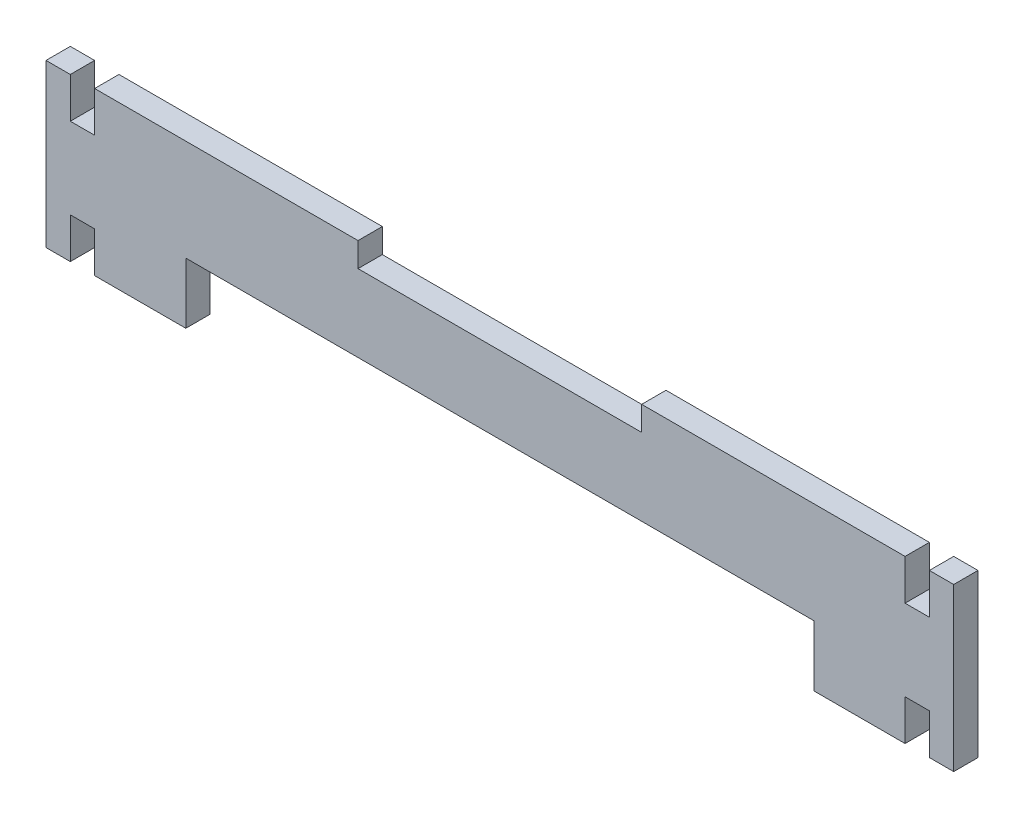
ISO-10303-21;
HEADER;
FILE_DESCRIPTION(('STEP AP214'),'2;1');
FILE_NAME('part.step','',(''),(''),'','','');
FILE_SCHEMA(('AUTOMOTIVE_DESIGN { 1 0 10303 214 1 1 1 1 }'));
ENDSEC;
DATA;
#1=APPLICATION_CONTEXT('core data for automotive mechanical design processes');
#2=APPLICATION_PROTOCOL_DEFINITION('international standard','automotive_design',2000,#1);
#3=PRODUCT_CONTEXT('',#1,'mechanical');
#4=PRODUCT('Part','Part','',(#3));
#5=PRODUCT_RELATED_PRODUCT_CATEGORY('part','',(#4));
#6=PRODUCT_DEFINITION_FORMATION('','',#4);
#7=PRODUCT_DEFINITION_CONTEXT('part definition',#1,'design');
#8=PRODUCT_DEFINITION('design','',#6,#7);
#9=PRODUCT_DEFINITION_SHAPE('','',#8);
#10=(LENGTH_UNIT() NAMED_UNIT(*) SI_UNIT(.MILLI.,.METRE.));
#11=(NAMED_UNIT(*) PLANE_ANGLE_UNIT() SI_UNIT($,.RADIAN.));
#12=(NAMED_UNIT(*) SI_UNIT($,.STERADIAN.) SOLID_ANGLE_UNIT());
#13=UNCERTAINTY_MEASURE_WITH_UNIT(LENGTH_MEASURE(1.E-05),#10,'distance_accuracy_value','');
#14=(GEOMETRIC_REPRESENTATION_CONTEXT(3) GLOBAL_UNCERTAINTY_ASSIGNED_CONTEXT((#13)) GLOBAL_UNIT_ASSIGNED_CONTEXT((#10,
#11,#12)) REPRESENTATION_CONTEXT('',''));
#15=CARTESIAN_POINT('',(0.,0.,0.));
#16=DIRECTION('',(0.,0.,1.));
#17=DIRECTION('',(1.,0.,0.));
#18=AXIS2_PLACEMENT_3D('',#15,#16,#17);
#19=CARTESIAN_POINT('',(0.,0.,6.));
#20=DIRECTION('',(0.,1.,0.));
#21=DIRECTION('',(-1.,0.,0.));
#22=AXIS2_PLACEMENT_3D('',#19,#20,#21);
#23=PLANE('',#22);
#24=DIRECTION('',(1.,0.,0.));
#25=VECTOR('',#24,1.);
#26=CARTESIAN_POINT('',(0.,0.,0.));
#27=LINE('',#26,#25);
#28=CARTESIAN_POINT('',(-212.,0.,0.));
#29=VERTEX_POINT('',#28);
#30=CARTESIAN_POINT('',(-189.5,0.,0.));
#31=VERTEX_POINT('',#30);
#32=EDGE_CURVE('E246',#29,#31,#27,.T.);
#33=ORIENTED_EDGE('',*,*,#32,.T.);
#34=DIRECTION('',(0.,0.,1.));
#35=VECTOR('',#34,1.);
#36=CARTESIAN_POINT('',(-189.5,0.,-4.));
#37=LINE('',#36,#35);
#38=CARTESIAN_POINT('',(-189.5,0.,6.));
#39=VERTEX_POINT('',#38);
#40=EDGE_CURVE('E231',#31,#39,#37,.T.);
#41=ORIENTED_EDGE('',*,*,#40,.T.);
#42=DIRECTION('',(1.,0.,0.));
#43=VECTOR('',#42,1.);
#44=CARTESIAN_POINT('',(0.,0.,6.));
#45=LINE('',#44,#43);
#46=CARTESIAN_POINT('',(-212.,0.,6.));
#47=VERTEX_POINT('',#46);
#48=EDGE_CURVE('E244',#47,#39,#45,.T.);
#49=ORIENTED_EDGE('',*,*,#48,.F.);
#50=DIRECTION('',(0.,0.,1.));
#51=VECTOR('',#50,1.);
#52=CARTESIAN_POINT('',(-212.,0.,0.));
#53=LINE('',#52,#51);
#54=EDGE_CURVE('E367',#29,#47,#53,.T.);
#55=ORIENTED_EDGE('',*,*,#54,.F.);
#56=EDGE_LOOP('',(#33,#41,#49,#55));
#57=FACE_BOUND('',#56,.T.);
#58=ADVANCED_FACE('F44',(#57),#23,.F.);
#59=CARTESIAN_POINT('',(0.,40.,6.));
#60=DIRECTION('',(0.,-1.,0.));
#61=DIRECTION('',(1.,0.,0.));
#62=AXIS2_PLACEMENT_3D('',#59,#60,#61);
#63=PLANE('',#62);
#64=DIRECTION('',(-1.,0.,0.));
#65=VECTOR('',#64,1.);
#66=CARTESIAN_POINT('',(0.,40.,6.));
#67=LINE('',#66,#65);
#68=CARTESIAN_POINT('',(-147.,40.,6.));
#69=VERTEX_POINT('',#68);
#70=CARTESIAN_POINT('',(-212.,40.,6.));
#71=VERTEX_POINT('',#70);
#72=EDGE_CURVE('E274',#69,#71,#67,.T.);
#73=ORIENTED_EDGE('',*,*,#72,.F.);
#74=DIRECTION('',(0.,0.,1.));
#75=VECTOR('',#74,1.);
#76=CARTESIAN_POINT('',(-147.,40.,0.));
#77=LINE('',#76,#75);
#78=CARTESIAN_POINT('',(-147.,40.,0.));
#79=VERTEX_POINT('',#78);
#80=EDGE_CURVE('E330',#79,#69,#77,.T.);
#81=ORIENTED_EDGE('',*,*,#80,.F.);
#82=DIRECTION('',(-1.,0.,0.));
#83=VECTOR('',#82,1.);
#84=CARTESIAN_POINT('',(0.,40.,0.));
#85=LINE('',#84,#83);
#86=CARTESIAN_POINT('',(-212.,40.,0.));
#87=VERTEX_POINT('',#86);
#88=EDGE_CURVE('E447',#79,#87,#85,.T.);
#89=ORIENTED_EDGE('',*,*,#88,.T.);
#90=DIRECTION('',(0.,0.,1.));
#91=VECTOR('',#90,1.);
#92=CARTESIAN_POINT('',(-212.,40.,0.));
#93=LINE('',#92,#91);
#94=EDGE_CURVE('E285',#87,#71,#93,.T.);
#95=ORIENTED_EDGE('',*,*,#94,.T.);
#96=EDGE_LOOP('',(#73,#81,#89,#95));
#97=FACE_BOUND('',#96,.T.);
#98=ADVANCED_FACE('F524',(#97),#63,.F.);
#99=CARTESIAN_POINT('',(-12.,40.,0.));
#100=VERTEX_POINT('',#99);
#101=CARTESIAN_POINT('',(-77.,40.,0.));
#102=VERTEX_POINT('',#101);
#103=EDGE_CURVE('E446',#100,#102,#85,.T.);
#104=ORIENTED_EDGE('',*,*,#103,.T.);
#105=DIRECTION('',(0.,0.,1.));
#106=VECTOR('',#105,1.);
#107=CARTESIAN_POINT('',(-77.,40.,0.));
#108=LINE('',#107,#106);
#109=CARTESIAN_POINT('',(-77.,40.,6.));
#110=VERTEX_POINT('',#109);
#111=EDGE_CURVE('E390',#102,#110,#108,.T.);
#112=ORIENTED_EDGE('',*,*,#111,.T.);
#113=CARTESIAN_POINT('',(-12.,40.,6.));
#114=VERTEX_POINT('',#113);
#115=EDGE_CURVE('E272',#114,#110,#67,.T.);
#116=ORIENTED_EDGE('',*,*,#115,.F.);
#117=DIRECTION('',(0.,0.,1.));
#118=VECTOR('',#117,1.);
#119=CARTESIAN_POINT('',(-12.,40.,0.));
#120=LINE('',#119,#118);
#121=EDGE_CURVE('E346',#100,#114,#120,.T.);
#122=ORIENTED_EDGE('',*,*,#121,.F.);
#123=EDGE_LOOP('',(#104,#112,#116,#122));
#124=FACE_BOUND('',#123,.T.);
#125=ADVANCED_FACE('F461',(#124),#63,.F.);
#126=CARTESIAN_POINT('',(-224.,0.,0.));
#127=VERTEX_POINT('',#126);
#128=CARTESIAN_POINT('',(-218.,0.,0.));
#129=VERTEX_POINT('',#128);
#130=EDGE_CURVE('E279',#127,#129,#27,.T.);
#131=ORIENTED_EDGE('',*,*,#130,.T.);
#132=DIRECTION('',(0.,0.,1.));
#133=VECTOR('',#132,1.);
#134=CARTESIAN_POINT('',(-218.,0.,0.));
#135=LINE('',#134,#133);
#136=CARTESIAN_POINT('',(-218.,0.,6.));
#137=VERTEX_POINT('',#136);
#138=EDGE_CURVE('E364',#129,#137,#135,.T.);
#139=ORIENTED_EDGE('',*,*,#138,.T.);
#140=CARTESIAN_POINT('',(-224.,0.,6.));
#141=VERTEX_POINT('',#140);
#142=EDGE_CURVE('E255',#141,#137,#45,.T.);
#143=ORIENTED_EDGE('',*,*,#142,.F.);
#144=DIRECTION('',(0.,0.,-1.));
#145=VECTOR('',#144,1.);
#146=CARTESIAN_POINT('',(-224.,0.,6.));
#147=LINE('',#146,#145);
#148=EDGE_CURVE('E434',#141,#127,#147,.T.);
#149=ORIENTED_EDGE('',*,*,#148,.T.);
#150=EDGE_LOOP('',(#131,#139,#143,#149));
#151=FACE_BOUND('',#150,.T.);
#152=ADVANCED_FACE('F484',(#151),#23,.F.);
#153=CARTESIAN_POINT('',(-34.5,0.,6.));
#154=VERTEX_POINT('',#153);
#155=CARTESIAN_POINT('',(-12.,0.,6.));
#156=VERTEX_POINT('',#155);
#157=EDGE_CURVE('E256',#154,#156,#45,.T.);
#158=ORIENTED_EDGE('',*,*,#157,.F.);
#159=DIRECTION('',(0.,0.,1.));
#160=VECTOR('',#159,1.);
#161=CARTESIAN_POINT('',(-34.5,0.,-4.));
#162=LINE('',#161,#160);
#163=CARTESIAN_POINT('',(-34.5,0.,0.));
#164=VERTEX_POINT('',#163);
#165=EDGE_CURVE('E247',#164,#154,#162,.T.);
#166=ORIENTED_EDGE('',*,*,#165,.F.);
#167=CARTESIAN_POINT('',(-12.,0.,0.));
#168=VERTEX_POINT('',#167);
#169=EDGE_CURVE('E425',#164,#168,#27,.T.);
#170=ORIENTED_EDGE('',*,*,#169,.T.);
#171=DIRECTION('',(0.,0.,1.));
#172=VECTOR('',#171,1.);
#173=CARTESIAN_POINT('',(-12.,0.,0.));
#174=LINE('',#173,#172);
#175=EDGE_CURVE('E309',#168,#156,#174,.T.);
#176=ORIENTED_EDGE('',*,*,#175,.T.);
#177=EDGE_LOOP('',(#158,#166,#170,#176));
#178=FACE_BOUND('',#177,.T.);
#179=ADVANCED_FACE('F533',(#178),#23,.F.);
#180=CARTESIAN_POINT('',(-218.,40.,6.));
#181=VERTEX_POINT('',#180);
#182=CARTESIAN_POINT('',(-224.,40.,6.));
#183=VERTEX_POINT('',#182);
#184=EDGE_CURVE('E275',#181,#183,#67,.T.);
#185=ORIENTED_EDGE('',*,*,#184,.F.);
#186=DIRECTION('',(0.,0.,1.));
#187=VECTOR('',#186,1.);
#188=CARTESIAN_POINT('',(-218.,40.,0.));
#189=LINE('',#188,#187);
#190=CARTESIAN_POINT('',(-218.,40.,0.));
#191=VERTEX_POINT('',#190);
#192=EDGE_CURVE('E288',#191,#181,#189,.T.);
#193=ORIENTED_EDGE('',*,*,#192,.F.);
#194=CARTESIAN_POINT('',(-224.,40.,0.));
#195=VERTEX_POINT('',#194);
#196=EDGE_CURVE('E448',#191,#195,#85,.T.);
#197=ORIENTED_EDGE('',*,*,#196,.T.);
#198=DIRECTION('',(0.,0.,-1.));
#199=VECTOR('',#198,1.);
#200=CARTESIAN_POINT('',(-224.,40.,6.));
#201=LINE('',#200,#199);
#202=EDGE_CURVE('E429',#183,#195,#201,.T.);
#203=ORIENTED_EDGE('',*,*,#202,.F.);
#204=EDGE_LOOP('',(#185,#193,#197,#203));
#205=FACE_BOUND('',#204,.T.);
#206=ADVANCED_FACE('F477',(#205),#63,.F.);
#207=CARTESIAN_POINT('',(0.,0.,6.));
#208=DIRECTION('',(-1.,0.,0.));
#209=DIRECTION('',(0.,0.,1.));
#210=AXIS2_PLACEMENT_3D('',#207,#208,#209);
#211=PLANE('',#210);
#212=DIRECTION('',(0.,1.,0.));
#213=VECTOR('',#212,1.);
#214=CARTESIAN_POINT('',(0.,0.,0.));
#215=LINE('',#214,#213);
#216=CARTESIAN_POINT('',(0.,0.,0.));
#217=VERTEX_POINT('',#216);
#218=CARTESIAN_POINT('',(0.,40.,0.));
#219=VERTEX_POINT('',#218);
#220=EDGE_CURVE('E290',#217,#219,#215,.T.);
#221=ORIENTED_EDGE('',*,*,#220,.T.);
#222=DIRECTION('',(0.,0.,-1.));
#223=VECTOR('',#222,1.);
#224=CARTESIAN_POINT('',(0.,40.,6.));
#225=LINE('',#224,#223);
#226=CARTESIAN_POINT('',(0.,40.,6.));
#227=VERTEX_POINT('',#226);
#228=EDGE_CURVE('E426',#227,#219,#225,.T.);
#229=ORIENTED_EDGE('',*,*,#228,.F.);
#230=DIRECTION('',(0.,1.,0.));
#231=VECTOR('',#230,1.);
#232=CARTESIAN_POINT('',(0.,0.,6.));
#233=LINE('',#232,#231);
#234=CARTESIAN_POINT('',(0.,0.,6.));
#235=VERTEX_POINT('',#234);
#236=EDGE_CURVE('E277',#235,#227,#233,.T.);
#237=ORIENTED_EDGE('',*,*,#236,.F.);
#238=DIRECTION('',(0.,0.,-1.));
#239=VECTOR('',#238,1.);
#240=CARTESIAN_POINT('',(0.,0.,6.));
#241=LINE('',#240,#239);
#242=EDGE_CURVE('E260',#235,#217,#241,.T.);
#243=ORIENTED_EDGE('',*,*,#242,.T.);
#244=EDGE_LOOP('',(#221,#229,#237,#243));
#245=FACE_BOUND('',#244,.T.);
#246=ADVANCED_FACE('F46',(#245),#211,.F.);
#247=CARTESIAN_POINT('',(-6.00000000000001,40.,0.));
#248=VERTEX_POINT('',#247);
#249=EDGE_CURVE('E444',#219,#248,#85,.T.);
#250=ORIENTED_EDGE('',*,*,#249,.T.);
#251=DIRECTION('',(0.,0.,1.));
#252=VECTOR('',#251,1.);
#253=CARTESIAN_POINT('',(-6.00000000000001,40.,0.));
#254=LINE('',#253,#252);
#255=CARTESIAN_POINT('',(-6.00000000000001,40.,6.));
#256=VERTEX_POINT('',#255);
#257=EDGE_CURVE('E343',#248,#256,#254,.T.);
#258=ORIENTED_EDGE('',*,*,#257,.T.);
#259=EDGE_CURVE('E268',#227,#256,#67,.T.);
#260=ORIENTED_EDGE('',*,*,#259,.F.);
#261=ORIENTED_EDGE('',*,*,#228,.T.);
#262=EDGE_LOOP('',(#250,#258,#260,#261));
#263=FACE_BOUND('',#262,.T.);
#264=ADVANCED_FACE('F500',(#263),#63,.F.);
#265=CARTESIAN_POINT('',(-224.,0.,6.));
#266=DIRECTION('',(1.,0.,0.));
#267=DIRECTION('',(0.,0.,-1.));
#268=AXIS2_PLACEMENT_3D('',#265,#266,#267);
#269=PLANE('',#268);
#270=DIRECTION('',(0.,-1.,0.));
#271=VECTOR('',#270,1.);
#272=CARTESIAN_POINT('',(-224.,0.,0.));
#273=LINE('',#272,#271);
#274=EDGE_CURVE('E441',#195,#127,#273,.T.);
#275=ORIENTED_EDGE('',*,*,#274,.T.);
#276=ORIENTED_EDGE('',*,*,#148,.F.);
#277=DIRECTION('',(0.,-1.,0.));
#278=VECTOR('',#277,1.);
#279=CARTESIAN_POINT('',(-224.,0.,6.));
#280=LINE('',#279,#278);
#281=EDGE_CURVE('E263',#183,#141,#280,.T.);
#282=ORIENTED_EDGE('',*,*,#281,.F.);
#283=ORIENTED_EDGE('',*,*,#202,.T.);
#284=EDGE_LOOP('',(#275,#276,#282,#283));
#285=FACE_BOUND('',#284,.T.);
#286=ADVANCED_FACE('F480',(#285),#269,.F.);
#287=CARTESIAN_POINT('',(-6.00000000000001,0.,6.));
#288=VERTEX_POINT('',#287);
#289=EDGE_CURVE('E258',#288,#235,#45,.T.);
#290=ORIENTED_EDGE('',*,*,#289,.F.);
#291=DIRECTION('',(0.,0.,1.));
#292=VECTOR('',#291,1.);
#293=CARTESIAN_POINT('',(-6.00000000000001,0.,0.));
#294=LINE('',#293,#292);
#295=CARTESIAN_POINT('',(-6.00000000000001,0.,0.));
#296=VERTEX_POINT('',#295);
#297=EDGE_CURVE('E312',#296,#288,#294,.T.);
#298=ORIENTED_EDGE('',*,*,#297,.F.);
#299=EDGE_CURVE('E443',#296,#217,#27,.T.);
#300=ORIENTED_EDGE('',*,*,#299,.T.);
#301=ORIENTED_EDGE('',*,*,#242,.F.);
#302=EDGE_LOOP('',(#290,#298,#300,#301));
#303=FACE_BOUND('',#302,.T.);
#304=ADVANCED_FACE('F497',(#303),#23,.F.);
#305=CARTESIAN_POINT('',(0.,0.,6.));
#306=DIRECTION('',(0.,0.,1.));
#307=DIRECTION('',(1.,0.,0.));
#308=AXIS2_PLACEMENT_3D('',#305,#306,#307);
#309=PLANE('',#308);
#310=DIRECTION('',(0.,-1.,0.));
#311=VECTOR('',#310,1.);
#312=CARTESIAN_POINT('',(-189.5,0.,6.));
#313=LINE('',#312,#311);
#314=CARTESIAN_POINT('',(-189.5,15.,6.));
#315=VERTEX_POINT('',#314);
#316=EDGE_CURVE('E228',#315,#39,#313,.T.);
#317=ORIENTED_EDGE('',*,*,#316,.F.);
#318=DIRECTION('',(-1.,0.,0.));
#319=VECTOR('',#318,1.);
#320=CARTESIAN_POINT('',(-189.5,15.,6.));
#321=LINE('',#320,#319);
#322=CARTESIAN_POINT('',(-34.5,15.,6.));
#323=VERTEX_POINT('',#322);
#324=EDGE_CURVE('E248',#323,#315,#321,.T.);
#325=ORIENTED_EDGE('',*,*,#324,.F.);
#326=DIRECTION('',(0.,1.,0.));
#327=VECTOR('',#326,1.);
#328=CARTESIAN_POINT('',(-34.5,0.,6.));
#329=LINE('',#328,#327);
#330=EDGE_CURVE('E238',#154,#323,#329,.T.);
#331=ORIENTED_EDGE('',*,*,#330,.F.);
#332=ORIENTED_EDGE('',*,*,#157,.T.);
#333=DIRECTION('',(0.,-1.,0.));
#334=VECTOR('',#333,1.);
#335=CARTESIAN_POINT('',(-12.,10.,6.));
#336=LINE('',#335,#334);
#337=CARTESIAN_POINT('',(-12.,10.,6.));
#338=VERTEX_POINT('',#337);
#339=EDGE_CURVE('E327',#338,#156,#336,.T.);
#340=ORIENTED_EDGE('',*,*,#339,.F.);
#341=DIRECTION('',(-1.,0.,0.));
#342=VECTOR('',#341,1.);
#343=CARTESIAN_POINT('',(-12.,10.,6.));
#344=LINE('',#343,#342);
#345=CARTESIAN_POINT('',(-6.00000000000001,10.,6.));
#346=VERTEX_POINT('',#345);
#347=EDGE_CURVE('E320',#346,#338,#344,.T.);
#348=ORIENTED_EDGE('',*,*,#347,.F.);
#349=DIRECTION('',(0.,1.,0.));
#350=VECTOR('',#349,1.);
#351=CARTESIAN_POINT('',(-6.00000000000001,10.,6.));
#352=LINE('',#351,#350);
#353=EDGE_CURVE('E324',#288,#346,#352,.T.);
#354=ORIENTED_EDGE('',*,*,#353,.F.);
#355=ORIENTED_EDGE('',*,*,#289,.T.);
#356=ORIENTED_EDGE('',*,*,#236,.T.);
#357=ORIENTED_EDGE('',*,*,#259,.T.);
#358=DIRECTION('',(0.,1.,0.));
#359=VECTOR('',#358,1.);
#360=CARTESIAN_POINT('',(-6.00000000000001,40.,6.));
#361=LINE('',#360,#359);
#362=CARTESIAN_POINT('',(-6.00000000000001,30.,6.));
#363=VERTEX_POINT('',#362);
#364=EDGE_CURVE('E349',#363,#256,#361,.T.);
#365=ORIENTED_EDGE('',*,*,#364,.F.);
#366=DIRECTION('',(1.,0.,0.));
#367=VECTOR('',#366,1.);
#368=CARTESIAN_POINT('',(-12.,30.,6.));
#369=LINE('',#368,#367);
#370=CARTESIAN_POINT('',(-12.,30.,6.));
#371=VERTEX_POINT('',#370);
#372=EDGE_CURVE('E352',#371,#363,#369,.T.);
#373=ORIENTED_EDGE('',*,*,#372,.F.);
#374=DIRECTION('',(0.,-1.,0.));
#375=VECTOR('',#374,1.);
#376=CARTESIAN_POINT('',(-12.,40.,6.));
#377=LINE('',#376,#375);
#378=EDGE_CURVE('E319',#114,#371,#377,.T.);
#379=ORIENTED_EDGE('',*,*,#378,.F.);
#380=ORIENTED_EDGE('',*,*,#115,.T.);
#381=DIRECTION('',(0.,1.,0.));
#382=VECTOR('',#381,1.);
#383=CARTESIAN_POINT('',(-77.,40.,6.));
#384=LINE('',#383,#382);
#385=CARTESIAN_POINT('',(-77.,34.,6.));
#386=VERTEX_POINT('',#385);
#387=EDGE_CURVE('E394',#386,#110,#384,.T.);
#388=ORIENTED_EDGE('',*,*,#387,.F.);
#389=DIRECTION('',(1.,0.,0.));
#390=VECTOR('',#389,1.);
#391=CARTESIAN_POINT('',(-147.,34.,6.));
#392=LINE('',#391,#390);
#393=CARTESIAN_POINT('',(-147.,34.,6.));
#394=VERTEX_POINT('',#393);
#395=EDGE_CURVE('E397',#394,#386,#392,.T.);
#396=ORIENTED_EDGE('',*,*,#395,.F.);
#397=DIRECTION('',(0.,-1.,0.));
#398=VECTOR('',#397,1.);
#399=CARTESIAN_POINT('',(-147.,40.,6.));
#400=LINE('',#399,#398);
#401=EDGE_CURVE('E400',#69,#394,#400,.T.);
#402=ORIENTED_EDGE('',*,*,#401,.F.);
#403=ORIENTED_EDGE('',*,*,#72,.T.);
#404=DIRECTION('',(0.,1.,0.));
#405=VECTOR('',#404,1.);
#406=CARTESIAN_POINT('',(-212.,40.,6.));
#407=LINE('',#406,#405);
#408=CARTESIAN_POINT('',(-212.,30.,6.));
#409=VERTEX_POINT('',#408);
#410=EDGE_CURVE('E291',#409,#71,#407,.T.);
#411=ORIENTED_EDGE('',*,*,#410,.F.);
#412=DIRECTION('',(1.,0.,0.));
#413=VECTOR('',#412,1.);
#414=CARTESIAN_POINT('',(-218.,30.,6.));
#415=LINE('',#414,#413);
#416=CARTESIAN_POINT('',(-218.,30.,6.));
#417=VERTEX_POINT('',#416);
#418=EDGE_CURVE('E295',#417,#409,#415,.T.);
#419=ORIENTED_EDGE('',*,*,#418,.F.);
#420=DIRECTION('',(0.,-1.,0.));
#421=VECTOR('',#420,1.);
#422=CARTESIAN_POINT('',(-218.,40.,6.));
#423=LINE('',#422,#421);
#424=EDGE_CURVE('E298',#181,#417,#423,.T.);
#425=ORIENTED_EDGE('',*,*,#424,.F.);
#426=ORIENTED_EDGE('',*,*,#184,.T.);
#427=ORIENTED_EDGE('',*,*,#281,.T.);
#428=ORIENTED_EDGE('',*,*,#142,.T.);
#429=DIRECTION('',(0.,-1.,0.));
#430=VECTOR('',#429,1.);
#431=CARTESIAN_POINT('',(-218.,10.,6.));
#432=LINE('',#431,#430);
#433=CARTESIAN_POINT('',(-218.,10.,6.));
#434=VERTEX_POINT('',#433);
#435=EDGE_CURVE('E348',#434,#137,#432,.T.);
#436=ORIENTED_EDGE('',*,*,#435,.F.);
#437=DIRECTION('',(-1.,0.,0.));
#438=VECTOR('',#437,1.);
#439=CARTESIAN_POINT('',(-218.,10.,6.));
#440=LINE('',#439,#438);
#441=CARTESIAN_POINT('',(-212.,10.,6.));
#442=VERTEX_POINT('',#441);
#443=EDGE_CURVE('E373',#442,#434,#440,.T.);
#444=ORIENTED_EDGE('',*,*,#443,.F.);
#445=DIRECTION('',(0.,1.,0.));
#446=VECTOR('',#445,1.);
#447=CARTESIAN_POINT('',(-212.,10.,6.));
#448=LINE('',#447,#446);
#449=EDGE_CURVE('E254',#47,#442,#448,.T.);
#450=ORIENTED_EDGE('',*,*,#449,.F.);
#451=ORIENTED_EDGE('',*,*,#48,.T.);
#452=EDGE_LOOP('',(#317,#325,#331,#332,#340,#348,#354,#355,#356,#357,#365,#373,#379,#380,#388,
#396,#402,#403,#411,#419,#425,#426,#427,#428,#436,#444,#450,#451));
#453=FACE_BOUND('',#452,.T.);
#454=ADVANCED_FACE('F251',(#453),#309,.T.);
#455=CARTESIAN_POINT('',(0.,0.,0.));
#456=DIRECTION('',(0.,0.,1.));
#457=DIRECTION('',(1.,0.,0.));
#458=AXIS2_PLACEMENT_3D('',#455,#456,#457);
#459=PLANE('',#458);
#460=DIRECTION('',(-1.,0.,0.));
#461=VECTOR('',#460,1.);
#462=CARTESIAN_POINT('',(0.,15.,0.));
#463=LINE('',#462,#461);
#464=CARTESIAN_POINT('',(-34.5,15.,0.));
#465=VERTEX_POINT('',#464);
#466=CARTESIAN_POINT('',(-189.5,15.,0.));
#467=VERTEX_POINT('',#466);
#468=EDGE_CURVE('E52',#465,#467,#463,.T.);
#469=ORIENTED_EDGE('',*,*,#468,.T.);
#470=DIRECTION('',(0.,-1.,0.));
#471=VECTOR('',#470,1.);
#472=CARTESIAN_POINT('',(-189.5,0.,0.));
#473=LINE('',#472,#471);
#474=EDGE_CURVE('E11',#467,#31,#473,.T.);
#475=ORIENTED_EDGE('',*,*,#474,.T.);
#476=ORIENTED_EDGE('',*,*,#32,.F.);
#477=DIRECTION('',(0.,1.,0.));
#478=VECTOR('',#477,1.);
#479=CARTESIAN_POINT('',(-212.,10.,0.));
#480=LINE('',#479,#478);
#481=CARTESIAN_POINT('',(-212.,10.,0.));
#482=VERTEX_POINT('',#481);
#483=EDGE_CURVE('E381',#29,#482,#480,.T.);
#484=ORIENTED_EDGE('',*,*,#483,.T.);
#485=DIRECTION('',(-1.,0.,0.));
#486=VECTOR('',#485,1.);
#487=CARTESIAN_POINT('',(-218.,10.,0.));
#488=LINE('',#487,#486);
#489=CARTESIAN_POINT('',(-218.,10.,0.));
#490=VERTEX_POINT('',#489);
#491=EDGE_CURVE('E368',#482,#490,#488,.T.);
#492=ORIENTED_EDGE('',*,*,#491,.T.);
#493=DIRECTION('',(0.,-1.,0.));
#494=VECTOR('',#493,1.);
#495=CARTESIAN_POINT('',(-218.,10.,0.));
#496=LINE('',#495,#494);
#497=EDGE_CURVE('E376',#490,#129,#496,.T.);
#498=ORIENTED_EDGE('',*,*,#497,.T.);
#499=ORIENTED_EDGE('',*,*,#130,.F.);
#500=ORIENTED_EDGE('',*,*,#274,.F.);
#501=ORIENTED_EDGE('',*,*,#196,.F.);
#502=DIRECTION('',(0.,-1.,0.));
#503=VECTOR('',#502,1.);
#504=CARTESIAN_POINT('',(-218.,40.,0.));
#505=LINE('',#504,#503);
#506=CARTESIAN_POINT('',(-218.,30.,0.));
#507=VERTEX_POINT('',#506);
#508=EDGE_CURVE('E294',#191,#507,#505,.T.);
#509=ORIENTED_EDGE('',*,*,#508,.T.);
#510=DIRECTION('',(1.,0.,0.));
#511=VECTOR('',#510,1.);
#512=CARTESIAN_POINT('',(-218.,30.,0.));
#513=LINE('',#512,#511);
#514=CARTESIAN_POINT('',(-212.,30.,0.));
#515=VERTEX_POINT('',#514);
#516=EDGE_CURVE('E304',#507,#515,#513,.T.);
#517=ORIENTED_EDGE('',*,*,#516,.T.);
#518=DIRECTION('',(0.,1.,0.));
#519=VECTOR('',#518,1.);
#520=CARTESIAN_POINT('',(-212.,40.,0.));
#521=LINE('',#520,#519);
#522=EDGE_CURVE('E283',#515,#87,#521,.T.);
#523=ORIENTED_EDGE('',*,*,#522,.T.);
#524=ORIENTED_EDGE('',*,*,#88,.F.);
#525=DIRECTION('',(0.,-1.,0.));
#526=VECTOR('',#525,1.);
#527=CARTESIAN_POINT('',(-147.,40.,0.));
#528=LINE('',#527,#526);
#529=CARTESIAN_POINT('',(-147.,34.,0.));
#530=VERTEX_POINT('',#529);
#531=EDGE_CURVE('E396',#79,#530,#528,.T.);
#532=ORIENTED_EDGE('',*,*,#531,.T.);
#533=DIRECTION('',(1.,0.,0.));
#534=VECTOR('',#533,1.);
#535=CARTESIAN_POINT('',(-147.,34.,0.));
#536=LINE('',#535,#534);
#537=CARTESIAN_POINT('',(-77.,34.,0.));
#538=VERTEX_POINT('',#537);
#539=EDGE_CURVE('E404',#530,#538,#536,.T.);
#540=ORIENTED_EDGE('',*,*,#539,.T.);
#541=DIRECTION('',(0.,1.,0.));
#542=VECTOR('',#541,1.);
#543=CARTESIAN_POINT('',(-77.,40.,0.));
#544=LINE('',#543,#542);
#545=EDGE_CURVE('E67',#538,#102,#544,.T.);
#546=ORIENTED_EDGE('',*,*,#545,.T.);
#547=ORIENTED_EDGE('',*,*,#103,.F.);
#548=DIRECTION('',(0.,-1.,0.));
#549=VECTOR('',#548,1.);
#550=CARTESIAN_POINT('',(-12.,40.,0.));
#551=LINE('',#550,#549);
#552=CARTESIAN_POINT('',(-12.,30.,0.));
#553=VERTEX_POINT('',#552);
#554=EDGE_CURVE('E351',#100,#553,#551,.T.);
#555=ORIENTED_EDGE('',*,*,#554,.T.);
#556=DIRECTION('',(1.,0.,0.));
#557=VECTOR('',#556,1.);
#558=CARTESIAN_POINT('',(-12.,30.,0.));
#559=LINE('',#558,#557);
#560=CARTESIAN_POINT('',(-6.00000000000001,30.,0.));
#561=VERTEX_POINT('',#560);
#562=EDGE_CURVE('E359',#553,#561,#559,.T.);
#563=ORIENTED_EDGE('',*,*,#562,.T.);
#564=DIRECTION('',(0.,1.,0.));
#565=VECTOR('',#564,1.);
#566=CARTESIAN_POINT('',(-6.00000000000001,40.,0.));
#567=LINE('',#566,#565);
#568=EDGE_CURVE('E341',#561,#248,#567,.T.);
#569=ORIENTED_EDGE('',*,*,#568,.T.);
#570=ORIENTED_EDGE('',*,*,#249,.F.);
#571=ORIENTED_EDGE('',*,*,#220,.F.);
#572=ORIENTED_EDGE('',*,*,#299,.F.);
#573=DIRECTION('',(0.,1.,0.));
#574=VECTOR('',#573,1.);
#575=CARTESIAN_POINT('',(-6.00000000000001,10.,0.));
#576=LINE('',#575,#574);
#577=CARTESIAN_POINT('',(-6.00000000000001,10.,0.));
#578=VERTEX_POINT('',#577);
#579=EDGE_CURVE('E333',#296,#578,#576,.T.);
#580=ORIENTED_EDGE('',*,*,#579,.T.);
#581=DIRECTION('',(-1.,0.,0.));
#582=VECTOR('',#581,1.);
#583=CARTESIAN_POINT('',(-12.,10.,0.));
#584=LINE('',#583,#582);
#585=CARTESIAN_POINT('',(-12.,10.,0.));
#586=VERTEX_POINT('',#585);
#587=EDGE_CURVE('E313',#578,#586,#584,.T.);
#588=ORIENTED_EDGE('',*,*,#587,.T.);
#589=DIRECTION('',(0.,-1.,0.));
#590=VECTOR('',#589,1.);
#591=CARTESIAN_POINT('',(-12.,10.,0.));
#592=LINE('',#591,#590);
#593=EDGE_CURVE('E323',#586,#168,#592,.T.);
#594=ORIENTED_EDGE('',*,*,#593,.T.);
#595=ORIENTED_EDGE('',*,*,#169,.F.);
#596=DIRECTION('',(0.,1.,0.));
#597=VECTOR('',#596,1.);
#598=CARTESIAN_POINT('',(-34.5,0.,0.));
#599=LINE('',#598,#597);
#600=EDGE_CURVE('E422',#164,#465,#599,.T.);
#601=ORIENTED_EDGE('',*,*,#600,.T.);
#602=EDGE_LOOP('',(#469,#475,#476,#484,#492,#498,#499,#500,#501,#509,#517,#523,#524,#532,#540,
#546,#547,#555,#563,#569,#570,#571,#572,#580,#588,#594,#595,#601));
#603=FACE_BOUND('',#602,.T.);
#604=ADVANCED_FACE('F424',(#603),#459,.F.);
#605=CARTESIAN_POINT('',(-218.,40.,0.));
#606=DIRECTION('',(-1.,0.,0.));
#607=DIRECTION('',(0.,0.,1.));
#608=AXIS2_PLACEMENT_3D('',#605,#606,#607);
#609=PLANE('',#608);
#610=ORIENTED_EDGE('',*,*,#424,.T.);
#611=DIRECTION('',(0.,0.,1.));
#612=VECTOR('',#611,1.);
#613=CARTESIAN_POINT('',(-218.,30.,0.));
#614=LINE('',#613,#612);
#615=EDGE_CURVE('E280',#507,#417,#614,.T.);
#616=ORIENTED_EDGE('',*,*,#615,.F.);
#617=ORIENTED_EDGE('',*,*,#508,.F.);
#618=ORIENTED_EDGE('',*,*,#192,.T.);
#619=EDGE_LOOP('',(#610,#616,#617,#618));
#620=FACE_BOUND('',#619,.T.);
#621=ADVANCED_FACE('F563',(#620),#609,.F.);
#622=CARTESIAN_POINT('',(-212.,40.,0.));
#623=DIRECTION('',(1.,0.,0.));
#624=DIRECTION('',(0.,0.,-1.));
#625=AXIS2_PLACEMENT_3D('',#622,#623,#624);
#626=PLANE('',#625);
#627=ORIENTED_EDGE('',*,*,#410,.T.);
#628=ORIENTED_EDGE('',*,*,#94,.F.);
#629=ORIENTED_EDGE('',*,*,#522,.F.);
#630=DIRECTION('',(0.,0.,1.));
#631=VECTOR('',#630,1.);
#632=CARTESIAN_POINT('',(-212.,30.,0.));
#633=LINE('',#632,#631);
#634=EDGE_CURVE('E282',#515,#409,#633,.T.);
#635=ORIENTED_EDGE('',*,*,#634,.T.);
#636=EDGE_LOOP('',(#627,#628,#629,#635));
#637=FACE_BOUND('',#636,.T.);
#638=ADVANCED_FACE('F560',(#637),#626,.F.);
#639=CARTESIAN_POINT('',(-218.,30.,0.));
#640=DIRECTION('',(0.,-1.,0.));
#641=DIRECTION('',(0.,0.,-1.));
#642=AXIS2_PLACEMENT_3D('',#639,#640,#641);
#643=PLANE('',#642);
#644=ORIENTED_EDGE('',*,*,#418,.T.);
#645=ORIENTED_EDGE('',*,*,#634,.F.);
#646=ORIENTED_EDGE('',*,*,#516,.F.);
#647=ORIENTED_EDGE('',*,*,#615,.T.);
#648=EDGE_LOOP('',(#644,#645,#646,#647));
#649=FACE_BOUND('',#648,.T.);
#650=ADVANCED_FACE('F557',(#649),#643,.F.);
#651=CARTESIAN_POINT('',(-12.,10.,0.));
#652=DIRECTION('',(-1.,0.,0.));
#653=DIRECTION('',(0.,0.,1.));
#654=AXIS2_PLACEMENT_3D('',#651,#652,#653);
#655=PLANE('',#654);
#656=ORIENTED_EDGE('',*,*,#339,.T.);
#657=ORIENTED_EDGE('',*,*,#175,.F.);
#658=ORIENTED_EDGE('',*,*,#593,.F.);
#659=DIRECTION('',(0.,0.,1.));
#660=VECTOR('',#659,1.);
#661=CARTESIAN_POINT('',(-12.,10.,0.));
#662=LINE('',#661,#660);
#663=EDGE_CURVE('E317',#586,#338,#662,.T.);
#664=ORIENTED_EDGE('',*,*,#663,.T.);
#665=EDGE_LOOP('',(#656,#657,#658,#664));
#666=FACE_BOUND('',#665,.T.);
#667=ADVANCED_FACE('F549',(#666),#655,.F.);
#668=CARTESIAN_POINT('',(-12.,10.,0.));
#669=DIRECTION('',(0.,1.,0.));
#670=DIRECTION('',(0.,0.,1.));
#671=AXIS2_PLACEMENT_3D('',#668,#669,#670);
#672=PLANE('',#671);
#673=ORIENTED_EDGE('',*,*,#347,.T.);
#674=ORIENTED_EDGE('',*,*,#663,.F.);
#675=ORIENTED_EDGE('',*,*,#587,.F.);
#676=DIRECTION('',(0.,0.,1.));
#677=VECTOR('',#676,1.);
#678=CARTESIAN_POINT('',(-6.00000000000001,10.,0.));
#679=LINE('',#678,#677);
#680=EDGE_CURVE('E315',#578,#346,#679,.T.);
#681=ORIENTED_EDGE('',*,*,#680,.T.);
#682=EDGE_LOOP('',(#673,#674,#675,#681));
#683=FACE_BOUND('',#682,.T.);
#684=ADVANCED_FACE('F518',(#683),#672,.F.);
#685=CARTESIAN_POINT('',(-6.00000000000001,10.,0.));
#686=DIRECTION('',(1.,0.,0.));
#687=DIRECTION('',(0.,0.,-1.));
#688=AXIS2_PLACEMENT_3D('',#685,#686,#687);
#689=PLANE('',#688);
#690=ORIENTED_EDGE('',*,*,#353,.T.);
#691=ORIENTED_EDGE('',*,*,#680,.F.);
#692=ORIENTED_EDGE('',*,*,#579,.F.);
#693=ORIENTED_EDGE('',*,*,#297,.T.);
#694=EDGE_LOOP('',(#690,#691,#692,#693));
#695=FACE_BOUND('',#694,.T.);
#696=ADVANCED_FACE('F511',(#695),#689,.F.);
#697=CARTESIAN_POINT('',(-12.,40.,0.));
#698=DIRECTION('',(-1.,0.,0.));
#699=DIRECTION('',(0.,0.,1.));
#700=AXIS2_PLACEMENT_3D('',#697,#698,#699);
#701=PLANE('',#700);
#702=ORIENTED_EDGE('',*,*,#378,.T.);
#703=DIRECTION('',(0.,0.,1.));
#704=VECTOR('',#703,1.);
#705=CARTESIAN_POINT('',(-12.,30.,0.));
#706=LINE('',#705,#704);
#707=EDGE_CURVE('E338',#553,#371,#706,.T.);
#708=ORIENTED_EDGE('',*,*,#707,.F.);
#709=ORIENTED_EDGE('',*,*,#554,.F.);
#710=ORIENTED_EDGE('',*,*,#121,.T.);
#711=EDGE_LOOP('',(#702,#708,#709,#710));
#712=FACE_BOUND('',#711,.T.);
#713=ADVANCED_FACE('F509',(#712),#701,.F.);
#714=CARTESIAN_POINT('',(-6.00000000000001,40.,0.));
#715=DIRECTION('',(1.,0.,0.));
#716=DIRECTION('',(0.,0.,-1.));
#717=AXIS2_PLACEMENT_3D('',#714,#715,#716);
#718=PLANE('',#717);
#719=ORIENTED_EDGE('',*,*,#364,.T.);
#720=ORIENTED_EDGE('',*,*,#257,.F.);
#721=ORIENTED_EDGE('',*,*,#568,.F.);
#722=DIRECTION('',(0.,0.,1.));
#723=VECTOR('',#722,1.);
#724=CARTESIAN_POINT('',(-6.00000000000001,30.,0.));
#725=LINE('',#724,#723);
#726=EDGE_CURVE('E340',#561,#363,#725,.T.);
#727=ORIENTED_EDGE('',*,*,#726,.T.);
#728=EDGE_LOOP('',(#719,#720,#721,#727));
#729=FACE_BOUND('',#728,.T.);
#730=ADVANCED_FACE('F503',(#729),#718,.F.);
#731=CARTESIAN_POINT('',(-12.,30.,0.));
#732=DIRECTION('',(0.,-1.,0.));
#733=DIRECTION('',(0.,0.,-1.));
#734=AXIS2_PLACEMENT_3D('',#731,#732,#733);
#735=PLANE('',#734);
#736=ORIENTED_EDGE('',*,*,#372,.T.);
#737=ORIENTED_EDGE('',*,*,#726,.F.);
#738=ORIENTED_EDGE('',*,*,#562,.F.);
#739=ORIENTED_EDGE('',*,*,#707,.T.);
#740=EDGE_LOOP('',(#736,#737,#738,#739));
#741=FACE_BOUND('',#740,.T.);
#742=ADVANCED_FACE('F507',(#741),#735,.F.);
#743=CARTESIAN_POINT('',(-218.,10.,0.));
#744=DIRECTION('',(-1.,0.,0.));
#745=DIRECTION('',(0.,0.,1.));
#746=AXIS2_PLACEMENT_3D('',#743,#744,#745);
#747=PLANE('',#746);
#748=ORIENTED_EDGE('',*,*,#435,.T.);
#749=ORIENTED_EDGE('',*,*,#138,.F.);
#750=ORIENTED_EDGE('',*,*,#497,.F.);
#751=DIRECTION('',(0.,0.,1.));
#752=VECTOR('',#751,1.);
#753=CARTESIAN_POINT('',(-218.,10.,0.));
#754=LINE('',#753,#752);
#755=EDGE_CURVE('E301',#490,#434,#754,.T.);
#756=ORIENTED_EDGE('',*,*,#755,.T.);
#757=EDGE_LOOP('',(#748,#749,#750,#756));
#758=FACE_BOUND('',#757,.T.);
#759=ADVANCED_FACE('F487',(#758),#747,.F.);
#760=CARTESIAN_POINT('',(-218.,10.,0.));
#761=DIRECTION('',(0.,1.,0.));
#762=DIRECTION('',(0.,0.,1.));
#763=AXIS2_PLACEMENT_3D('',#760,#761,#762);
#764=PLANE('',#763);
#765=ORIENTED_EDGE('',*,*,#443,.T.);
#766=ORIENTED_EDGE('',*,*,#755,.F.);
#767=ORIENTED_EDGE('',*,*,#491,.F.);
#768=DIRECTION('',(0.,0.,1.));
#769=VECTOR('',#768,1.);
#770=CARTESIAN_POINT('',(-212.,10.,0.));
#771=LINE('',#770,#769);
#772=EDGE_CURVE('E370',#482,#442,#771,.T.);
#773=ORIENTED_EDGE('',*,*,#772,.T.);
#774=EDGE_LOOP('',(#765,#766,#767,#773));
#775=FACE_BOUND('',#774,.T.);
#776=ADVANCED_FACE('F490',(#775),#764,.F.);
#777=CARTESIAN_POINT('',(-212.,10.,0.));
#778=DIRECTION('',(1.,0.,0.));
#779=DIRECTION('',(0.,0.,-1.));
#780=AXIS2_PLACEMENT_3D('',#777,#778,#779);
#781=PLANE('',#780);
#782=ORIENTED_EDGE('',*,*,#449,.T.);
#783=ORIENTED_EDGE('',*,*,#772,.F.);
#784=ORIENTED_EDGE('',*,*,#483,.F.);
#785=ORIENTED_EDGE('',*,*,#54,.T.);
#786=EDGE_LOOP('',(#782,#783,#784,#785));
#787=FACE_BOUND('',#786,.T.);
#788=ADVANCED_FACE('F493',(#787),#781,.F.);
#789=CARTESIAN_POINT('',(-147.,40.,0.));
#790=DIRECTION('',(-1.,0.,0.));
#791=DIRECTION('',(0.,0.,1.));
#792=AXIS2_PLACEMENT_3D('',#789,#790,#791);
#793=PLANE('',#792);
#794=ORIENTED_EDGE('',*,*,#401,.T.);
#795=DIRECTION('',(0.,0.,1.));
#796=VECTOR('',#795,1.);
#797=CARTESIAN_POINT('',(-147.,34.,0.));
#798=LINE('',#797,#796);
#799=EDGE_CURVE('E386',#530,#394,#798,.T.);
#800=ORIENTED_EDGE('',*,*,#799,.F.);
#801=ORIENTED_EDGE('',*,*,#531,.F.);
#802=ORIENTED_EDGE('',*,*,#80,.T.);
#803=EDGE_LOOP('',(#794,#800,#801,#802));
#804=FACE_BOUND('',#803,.T.);
#805=ADVANCED_FACE('F658',(#804),#793,.F.);
#806=CARTESIAN_POINT('',(-77.,40.,0.));
#807=DIRECTION('',(1.,0.,0.));
#808=DIRECTION('',(0.,0.,-1.));
#809=AXIS2_PLACEMENT_3D('',#806,#807,#808);
#810=PLANE('',#809);
#811=ORIENTED_EDGE('',*,*,#387,.T.);
#812=ORIENTED_EDGE('',*,*,#111,.F.);
#813=ORIENTED_EDGE('',*,*,#545,.F.);
#814=DIRECTION('',(0.,0.,1.));
#815=VECTOR('',#814,1.);
#816=CARTESIAN_POINT('',(-77.,34.,0.));
#817=LINE('',#816,#815);
#818=EDGE_CURVE('E388',#538,#386,#817,.T.);
#819=ORIENTED_EDGE('',*,*,#818,.T.);
#820=EDGE_LOOP('',(#811,#812,#813,#819));
#821=FACE_BOUND('',#820,.T.);
#822=ADVANCED_FACE('F470',(#821),#810,.F.);
#823=CARTESIAN_POINT('',(-147.,34.,0.));
#824=DIRECTION('',(0.,-1.,0.));
#825=DIRECTION('',(1.,0.,0.));
#826=AXIS2_PLACEMENT_3D('',#823,#824,#825);
#827=PLANE('',#826);
#828=ORIENTED_EDGE('',*,*,#395,.T.);
#829=ORIENTED_EDGE('',*,*,#818,.F.);
#830=ORIENTED_EDGE('',*,*,#539,.F.);
#831=ORIENTED_EDGE('',*,*,#799,.T.);
#832=EDGE_LOOP('',(#828,#829,#830,#831));
#833=FACE_BOUND('',#832,.T.);
#834=ADVANCED_FACE('F467',(#833),#827,.F.);
#835=CARTESIAN_POINT('',(-189.5,0.,-4.));
#836=DIRECTION('',(-1.,0.,0.));
#837=DIRECTION('',(0.,0.,1.));
#838=AXIS2_PLACEMENT_3D('',#835,#836,#837);
#839=PLANE('',#838);
#840=DIRECTION('',(0.,0.,1.));
#841=VECTOR('',#840,1.);
#842=CARTESIAN_POINT('',(-189.5,15.,-4.));
#843=LINE('',#842,#841);
#844=EDGE_CURVE('E233',#467,#315,#843,.T.);
#845=ORIENTED_EDGE('',*,*,#844,.T.);
#846=ORIENTED_EDGE('',*,*,#316,.T.);
#847=ORIENTED_EDGE('',*,*,#40,.F.);
#848=ORIENTED_EDGE('',*,*,#474,.F.);
#849=EDGE_LOOP('',(#845,#846,#847,#848));
#850=FACE_BOUND('',#849,.T.);
#851=ADVANCED_FACE('F230',(#850),#839,.F.);
#852=CARTESIAN_POINT('',(-189.5,15.,-4.));
#853=DIRECTION('',(0.,1.,0.));
#854=DIRECTION('',(-1.,0.,0.));
#855=AXIS2_PLACEMENT_3D('',#852,#853,#854);
#856=PLANE('',#855);
#857=DIRECTION('',(0.,0.,1.));
#858=VECTOR('',#857,1.);
#859=CARTESIAN_POINT('',(-34.5,15.,-4.));
#860=LINE('',#859,#858);
#861=EDGE_CURVE('E59',#465,#323,#860,.T.);
#862=ORIENTED_EDGE('',*,*,#861,.T.);
#863=ORIENTED_EDGE('',*,*,#324,.T.);
#864=ORIENTED_EDGE('',*,*,#844,.F.);
#865=ORIENTED_EDGE('',*,*,#468,.F.);
#866=EDGE_LOOP('',(#862,#863,#864,#865));
#867=FACE_BOUND('',#866,.T.);
#868=ADVANCED_FACE('F418',(#867),#856,.F.);
#869=CARTESIAN_POINT('',(-34.5,0.,-4.));
#870=DIRECTION('',(1.,0.,0.));
#871=DIRECTION('',(0.,0.,-1.));
#872=AXIS2_PLACEMENT_3D('',#869,#870,#871);
#873=PLANE('',#872);
#874=ORIENTED_EDGE('',*,*,#165,.T.);
#875=ORIENTED_EDGE('',*,*,#330,.T.);
#876=ORIENTED_EDGE('',*,*,#861,.F.);
#877=ORIENTED_EDGE('',*,*,#600,.F.);
#878=EDGE_LOOP('',(#874,#875,#876,#877));
#879=FACE_BOUND('',#878,.T.);
#880=ADVANCED_FACE('F414',(#879),#873,.F.);
#881=CLOSED_SHELL('',(#58,#98,#125,#152,#179,#206,#246,#264,#286,#304,#454,#604,#621,#638,#650,
#667,#684,#696,#713,#730,#742,#759,#776,#788,#805,#822,#834,#851,#868,#880));
#882=MANIFOLD_SOLID_BREP('B2',#881);
#883=ADVANCED_BREP_SHAPE_REPRESENTATION('',(#18,#882),#14);
#884=SHAPE_DEFINITION_REPRESENTATION(#9,#883);
ENDSEC;
END-ISO-10303-21;
